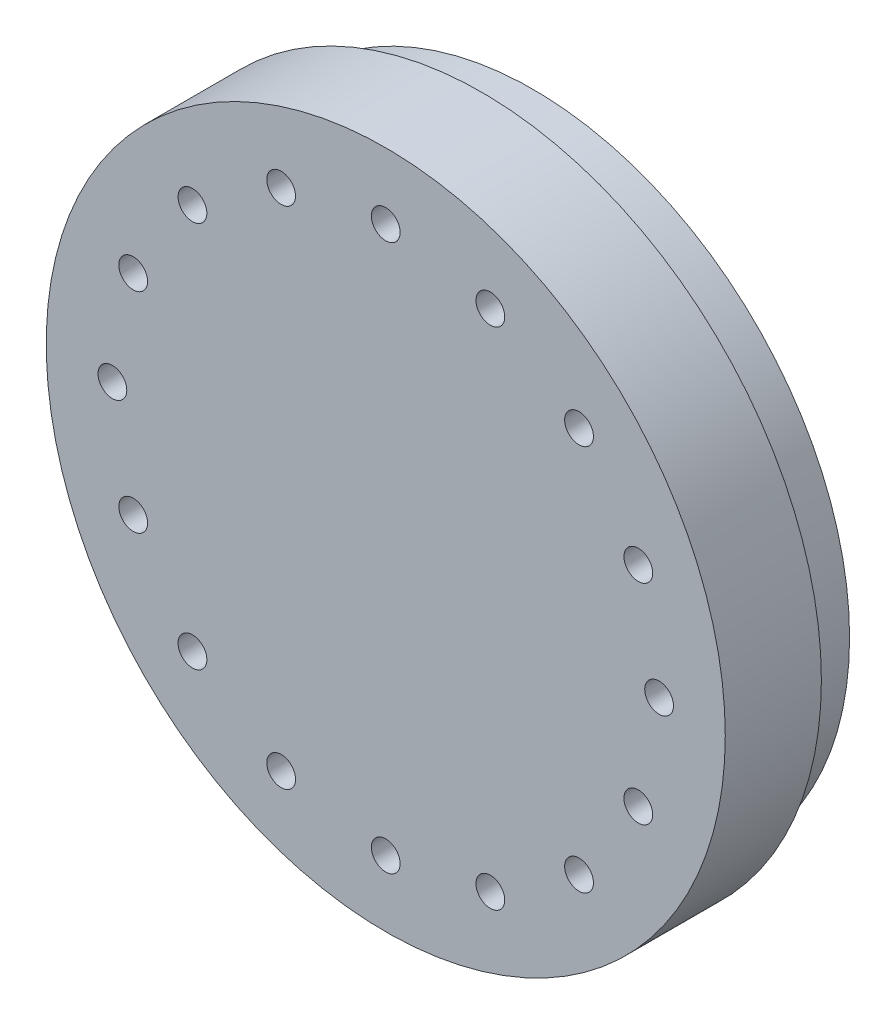
ISO-10303-21;
HEADER;
FILE_DESCRIPTION(('STEP AP214'),'2;1');
FILE_NAME('part.step','',(''),(''),'','','');
FILE_SCHEMA(('AUTOMOTIVE_DESIGN { 1 0 10303 214 1 1 1 1 }'));
ENDSEC;
DATA;
#1=APPLICATION_CONTEXT('core data for automotive mechanical design processes');
#2=APPLICATION_PROTOCOL_DEFINITION('international standard','automotive_design',2000,#1);
#3=PRODUCT_CONTEXT('',#1,'mechanical');
#4=PRODUCT('Part','Part','',(#3));
#5=PRODUCT_RELATED_PRODUCT_CATEGORY('part','',(#4));
#6=PRODUCT_DEFINITION_FORMATION('','',#4);
#7=PRODUCT_DEFINITION_CONTEXT('part definition',#1,'design');
#8=PRODUCT_DEFINITION('design','',#6,#7);
#9=PRODUCT_DEFINITION_SHAPE('','',#8);
#10=(LENGTH_UNIT() NAMED_UNIT(*) SI_UNIT(.MILLI.,.METRE.));
#11=(NAMED_UNIT(*) PLANE_ANGLE_UNIT() SI_UNIT($,.RADIAN.));
#12=(NAMED_UNIT(*) SI_UNIT($,.STERADIAN.) SOLID_ANGLE_UNIT());
#13=UNCERTAINTY_MEASURE_WITH_UNIT(LENGTH_MEASURE(1.E-05),#10,'distance_accuracy_value','');
#14=(GEOMETRIC_REPRESENTATION_CONTEXT(3) GLOBAL_UNCERTAINTY_ASSIGNED_CONTEXT((#13)) GLOBAL_UNIT_ASSIGNED_CONTEXT((#10,
#11,#12)) REPRESENTATION_CONTEXT('',''));
#15=CARTESIAN_POINT('',(0.,0.,0.));
#16=DIRECTION('',(0.,0.,1.));
#17=DIRECTION('',(1.,0.,0.));
#18=AXIS2_PLACEMENT_3D('',#15,#16,#17);
#19=CARTESIAN_POINT('',(0.,0.,4.175));
#20=DIRECTION('',(0.,0.,-1.));
#21=DIRECTION('',(-1.,0.,0.));
#22=AXIS2_PLACEMENT_3D('',#19,#20,#21);
#23=CYLINDRICAL_SURFACE('',#22,29.5);
#24=CARTESIAN_POINT('',(0.,0.,4.175));
#25=DIRECTION('',(0.,0.,1.));
#26=DIRECTION('',(1.,0.,0.));
#27=AXIS2_PLACEMENT_3D('',#24,#25,#26);
#28=CIRCLE('',#27,29.5);
#29=CARTESIAN_POINT('',(29.5,0.,4.175));
#30=VERTEX_POINT('',#29);
#31=EDGE_CURVE('E44',#30,#30,#28,.T.);
#32=ORIENTED_EDGE('',*,*,#31,.F.);
#33=EDGE_LOOP('',(#32));
#34=FACE_BOUND('',#33,.T.);
#35=CARTESIAN_POINT('',(0.,0.,-4.175));
#36=DIRECTION('',(0.,0.,1.));
#37=DIRECTION('',(1.,0.,0.));
#38=AXIS2_PLACEMENT_3D('',#35,#36,#37);
#39=CIRCLE('',#38,29.5);
#40=CARTESIAN_POINT('',(29.5,0.,-4.175));
#41=VERTEX_POINT('',#40);
#42=EDGE_CURVE('E40',#41,#41,#39,.T.);
#43=ORIENTED_EDGE('',*,*,#42,.T.);
#44=EDGE_LOOP('',(#43));
#45=FACE_BOUND('',#44,.T.);
#46=ADVANCED_FACE('F37',(#34,#45),#23,.T.);
#47=CARTESIAN_POINT('',(0.,0.,4.175));
#48=DIRECTION('',(0.,0.,1.));
#49=DIRECTION('',(1.,0.,0.));
#50=AXIS2_PLACEMENT_3D('',#47,#48,#49);
#51=PLANE('',#50);
#52=CARTESIAN_POINT('',(16.7937860531805,16.7937860531805,4.175));
#53=DIRECTION('',(0.,0.,1.));
#54=DIRECTION('',(0.707106781186546,-0.707106781186549,0.));
#55=AXIS2_PLACEMENT_3D('',#52,#53,#54);
#56=CIRCLE('',#55,1.25);
#57=CARTESIAN_POINT('',(17.6776695296637,15.9099025766973,4.175));
#58=VERTEX_POINT('',#57);
#59=EDGE_CURVE('E109',#58,#58,#56,.T.);
#60=ORIENTED_EDGE('',*,*,#59,.F.);
#61=EDGE_LOOP('',(#60));
#62=FACE_BOUND('',#61,.T.);
#63=CARTESIAN_POINT('',(21.9421388971431,9.08873151867083,4.175));
#64=DIRECTION('',(0.,0.,1.));
#65=DIRECTION('',(0.382683432365087,-0.923879532511288,0.));
#66=AXIS2_PLACEMENT_3D('',#63,#64,#65);
#67=CIRCLE('',#66,1.25);
#68=CARTESIAN_POINT('',(22.4204931875995,7.93388210303172,4.175));
#69=VERTEX_POINT('',#68);
#70=EDGE_CURVE('E103',#69,#69,#67,.T.);
#71=ORIENTED_EDGE('',*,*,#70,.F.);
#72=EDGE_LOOP('',(#71));
#73=FACE_BOUND('',#72,.T.);
#74=CARTESIAN_POINT('',(23.75,0.,4.175));
#75=DIRECTION('',(0.,0.,1.));
#76=DIRECTION('',(0.,-1.,0.));
#77=AXIS2_PLACEMENT_3D('',#74,#75,#76);
#78=CIRCLE('',#77,1.25);
#79=CARTESIAN_POINT('',(23.75,-1.25000000000008,4.175));
#80=VERTEX_POINT('',#79);
#81=EDGE_CURVE('E97',#80,#80,#78,.T.);
#82=ORIENTED_EDGE('',*,*,#81,.F.);
#83=EDGE_LOOP('',(#82));
#84=FACE_BOUND('',#83,.T.);
#85=CARTESIAN_POINT('',(21.942138897143,-9.08873151867098,4.175));
#86=DIRECTION('',(0.,0.,1.));
#87=DIRECTION('',(-0.382683432365094,-0.923879532511285,0.));
#88=AXIS2_PLACEMENT_3D('',#85,#86,#87);
#89=CIRCLE('',#88,1.25);
#90=CARTESIAN_POINT('',(21.4637846066867,-10.2435809343101,4.175));
#91=VERTEX_POINT('',#90);
#92=EDGE_CURVE('E91',#91,#91,#89,.T.);
#93=ORIENTED_EDGE('',*,*,#92,.F.);
#94=EDGE_LOOP('',(#93));
#95=FACE_BOUND('',#94,.T.);
#96=CARTESIAN_POINT('',(16.7937860531804,-16.7937860531806,4.175));
#97=DIRECTION('',(0.,0.,1.));
#98=DIRECTION('',(-0.707106781186551,-0.707106781186544,0.));
#99=AXIS2_PLACEMENT_3D('',#96,#97,#98);
#100=CIRCLE('',#99,1.25);
#101=CARTESIAN_POINT('',(15.9099025766972,-17.6776695296638,4.175));
#102=VERTEX_POINT('',#101);
#103=EDGE_CURVE('E85',#102,#102,#100,.T.);
#104=ORIENTED_EDGE('',*,*,#103,.F.);
#105=EDGE_LOOP('',(#104));
#106=FACE_BOUND('',#105,.T.);
#107=CARTESIAN_POINT('',(9.08873151867075,-21.9421388971431,4.175));
#108=DIRECTION('',(0.,0.,1.));
#109=DIRECTION('',(-0.923879532511289,-0.382683432365084,0.));
#110=AXIS2_PLACEMENT_3D('',#107,#108,#109);
#111=CIRCLE('',#110,1.25);
#112=CARTESIAN_POINT('',(7.93388210303164,-22.4204931875995,4.175));
#113=VERTEX_POINT('',#112);
#114=EDGE_CURVE('E79',#113,#113,#111,.T.);
#115=ORIENTED_EDGE('',*,*,#114,.F.);
#116=EDGE_LOOP('',(#115));
#117=FACE_BOUND('',#116,.T.);
#118=CARTESIAN_POINT('',(0.,-23.75,4.175));
#119=DIRECTION('',(0.,0.,1.));
#120=DIRECTION('',(-1.,0.,0.));
#121=AXIS2_PLACEMENT_3D('',#118,#119,#120);
#122=CIRCLE('',#121,1.25);
#123=CARTESIAN_POINT('',(-1.25,-23.75,4.175));
#124=VERTEX_POINT('',#123);
#125=EDGE_CURVE('E73',#124,#124,#122,.T.);
#126=ORIENTED_EDGE('',*,*,#125,.F.);
#127=EDGE_LOOP('',(#126));
#128=FACE_BOUND('',#127,.T.);
#129=CARTESIAN_POINT('',(-9.08873151867106,-21.942138897143,4.175));
#130=DIRECTION('',(0.,0.,1.));
#131=DIRECTION('',(-0.923879532511284,0.382683432365097,0.));
#132=AXIS2_PLACEMENT_3D('',#129,#130,#131);
#133=CIRCLE('',#132,1.25);
#134=CARTESIAN_POINT('',(-10.2435809343102,-21.4637846066866,4.175));
#135=VERTEX_POINT('',#134);
#136=EDGE_CURVE('E66',#135,#135,#133,.T.);
#137=ORIENTED_EDGE('',*,*,#136,.F.);
#138=EDGE_LOOP('',(#137));
#139=FACE_BOUND('',#138,.T.);
#140=CARTESIAN_POINT('',(-16.7937860531807,-16.7937860531804,4.175));
#141=DIRECTION('',(0.,0.,1.));
#142=DIRECTION('',(-0.707106781186541,0.707106781186554,0.));
#143=AXIS2_PLACEMENT_3D('',#140,#141,#142);
#144=CIRCLE('',#143,1.25);
#145=CARTESIAN_POINT('',(-17.6776695296638,-15.9099025766972,4.175));
#146=VERTEX_POINT('',#145);
#147=EDGE_CURVE('E144',#146,#146,#144,.T.);
#148=ORIENTED_EDGE('',*,*,#147,.F.);
#149=EDGE_LOOP('',(#148));
#150=FACE_BOUND('',#149,.T.);
#151=CARTESIAN_POINT('',(-21.9421388971432,-9.08873151867066,4.175));
#152=DIRECTION('',(0.,0.,1.));
#153=DIRECTION('',(-0.382683432365081,0.923879532511291,0.));
#154=AXIS2_PLACEMENT_3D('',#151,#152,#153);
#155=CIRCLE('',#154,1.25);
#156=CARTESIAN_POINT('',(-22.4204931875995,-7.93388210303155,4.175));
#157=VERTEX_POINT('',#156);
#158=EDGE_CURVE('E138',#157,#157,#155,.T.);
#159=ORIENTED_EDGE('',*,*,#158,.F.);
#160=EDGE_LOOP('',(#159));
#161=FACE_BOUND('',#160,.T.);
#162=CARTESIAN_POINT('',(-23.75,2.48768045392573E-13,4.175));
#163=DIRECTION('',(0.,0.,1.));
#164=DIRECTION('',(0.,1.,0.));
#165=AXIS2_PLACEMENT_3D('',#162,#163,#164);
#166=CIRCLE('',#165,1.25);
#167=CARTESIAN_POINT('',(-23.75,1.25000000000025,4.175));
#168=VERTEX_POINT('',#167);
#169=EDGE_CURVE('E132',#168,#168,#166,.T.);
#170=ORIENTED_EDGE('',*,*,#169,.F.);
#171=EDGE_LOOP('',(#170));
#172=FACE_BOUND('',#171,.T.);
#173=CARTESIAN_POINT('',(-21.942138897143,9.08873151867112,4.175));
#174=DIRECTION('',(0.,0.,1.));
#175=DIRECTION('',(0.3826834323651,0.923879532511283,0.));
#176=AXIS2_PLACEMENT_3D('',#173,#174,#175);
#177=CIRCLE('',#176,1.25);
#178=CARTESIAN_POINT('',(-21.4637846066866,10.2435809343102,4.175));
#179=VERTEX_POINT('',#178);
#180=EDGE_CURVE('E126',#179,#179,#177,.T.);
#181=ORIENTED_EDGE('',*,*,#180,.F.);
#182=EDGE_LOOP('',(#181));
#183=FACE_BOUND('',#182,.T.);
#184=CARTESIAN_POINT('',(-16.7937860531803,16.7937860531807,4.175));
#185=DIRECTION('',(0.,0.,1.));
#186=DIRECTION('',(0.707106781186556,0.707106781186539,0.));
#187=AXIS2_PLACEMENT_3D('',#184,#185,#186);
#188=CIRCLE('',#187,1.25);
#189=CARTESIAN_POINT('',(-15.9099025766971,17.6776695296639,4.175));
#190=VERTEX_POINT('',#189);
#191=EDGE_CURVE('E120',#190,#190,#188,.T.);
#192=ORIENTED_EDGE('',*,*,#191,.F.);
#193=EDGE_LOOP('',(#192));
#194=FACE_BOUND('',#193,.T.);
#195=CARTESIAN_POINT('',(-9.08873151867059,21.9421388971432,4.175));
#196=DIRECTION('',(0.,0.,1.));
#197=DIRECTION('',(0.923879532511292,0.382683432365077,0.));
#198=AXIS2_PLACEMENT_3D('',#195,#196,#197);
#199=CIRCLE('',#198,1.25);
#200=CARTESIAN_POINT('',(-7.93388210303147,22.4204931875995,4.175));
#201=VERTEX_POINT('',#200);
#202=EDGE_CURVE('E114',#201,#201,#199,.T.);
#203=ORIENTED_EDGE('',*,*,#202,.F.);
#204=EDGE_LOOP('',(#203));
#205=FACE_BOUND('',#204,.T.);
#206=CARTESIAN_POINT('',(9.0887315186709,21.9421388971431,4.175));
#207=DIRECTION('',(0.,0.,1.));
#208=DIRECTION('',(0.923879532511287,-0.382683432365091,0.));
#209=AXIS2_PLACEMENT_3D('',#206,#207,#208);
#210=CIRCLE('',#209,1.25);
#211=CARTESIAN_POINT('',(10.24358093431,21.4637846066867,4.175));
#212=VERTEX_POINT('',#211);
#213=EDGE_CURVE('E60',#212,#212,#210,.T.);
#214=ORIENTED_EDGE('',*,*,#213,.F.);
#215=EDGE_LOOP('',(#214));
#216=FACE_BOUND('',#215,.T.);
#217=CARTESIAN_POINT('',(0.,23.75,4.175));
#218=DIRECTION('',(0.,0.,1.));
#219=DIRECTION('',(1.,0.,0.));
#220=AXIS2_PLACEMENT_3D('',#217,#218,#219);
#221=CIRCLE('',#220,1.25);
#222=CARTESIAN_POINT('',(1.25,23.75,4.175));
#223=VERTEX_POINT('',#222);
#224=EDGE_CURVE('E54',#223,#223,#221,.T.);
#225=ORIENTED_EDGE('',*,*,#224,.F.);
#226=EDGE_LOOP('',(#225));
#227=FACE_BOUND('',#226,.T.);
#228=ORIENTED_EDGE('',*,*,#31,.T.);
#229=EDGE_LOOP('',(#228));
#230=FACE_BOUND('',#229,.T.);
#231=ADVANCED_FACE('F161',(#62,#73,#84,#95,#106,#117,#128,#139,#150,#161,#172,#183,#194,#205,
#216,#227,#230),#51,.T.);
#232=CARTESIAN_POINT('',(0.,0.,-4.175));
#233=DIRECTION('',(0.,0.,1.));
#234=DIRECTION('',(1.,0.,0.));
#235=AXIS2_PLACEMENT_3D('',#232,#233,#234);
#236=PLANE('',#235);
#237=CARTESIAN_POINT('',(0.,0.,-4.175));
#238=DIRECTION('',(0.,0.,-1.));
#239=DIRECTION('',(-1.,0.,0.));
#240=AXIS2_PLACEMENT_3D('',#237,#238,#239);
#241=CIRCLE('',#240,27.5);
#242=CARTESIAN_POINT('',(-27.5,0.,-4.175));
#243=VERTEX_POINT('',#242);
#244=EDGE_CURVE('E10',#243,#243,#241,.T.);
#245=ORIENTED_EDGE('',*,*,#244,.F.);
#246=EDGE_LOOP('',(#245));
#247=FACE_BOUND('',#246,.T.);
#248=ORIENTED_EDGE('',*,*,#42,.F.);
#249=EDGE_LOOP('',(#248));
#250=FACE_BOUND('',#249,.T.);
#251=ADVANCED_FACE('F164',(#247,#250),#236,.F.);
#252=CARTESIAN_POINT('',(0.,0.,-8.625));
#253=DIRECTION('',(0.,0.,1.));
#254=DIRECTION('',(1.,0.,0.));
#255=AXIS2_PLACEMENT_3D('',#252,#253,#254);
#256=CYLINDRICAL_SURFACE('',#255,27.5);
#257=CARTESIAN_POINT('',(0.,0.,-8.625));
#258=DIRECTION('',(0.,0.,-1.));
#259=DIRECTION('',(-1.,0.,0.));
#260=AXIS2_PLACEMENT_3D('',#257,#258,#259);
#261=CIRCLE('',#260,27.5);
#262=CARTESIAN_POINT('',(-27.5,0.,-8.625));
#263=VERTEX_POINT('',#262);
#264=EDGE_CURVE('E50',#263,#263,#261,.T.);
#265=ORIENTED_EDGE('',*,*,#264,.F.);
#266=EDGE_LOOP('',(#265));
#267=FACE_BOUND('',#266,.T.);
#268=ORIENTED_EDGE('',*,*,#244,.T.);
#269=EDGE_LOOP('',(#268));
#270=FACE_BOUND('',#269,.T.);
#271=ADVANCED_FACE('F189',(#267,#270),#256,.T.);
#272=CARTESIAN_POINT('',(0.,0.,-8.625));
#273=DIRECTION('',(0.,0.,-1.));
#274=DIRECTION('',(-1.,0.,0.));
#275=AXIS2_PLACEMENT_3D('',#272,#273,#274);
#276=PLANE('',#275);
#277=CARTESIAN_POINT('',(16.7937860531805,16.7937860531805,-8.625));
#278=DIRECTION('',(0.,0.,1.));
#279=DIRECTION('',(0.707106781186546,-0.707106781186549,0.));
#280=AXIS2_PLACEMENT_3D('',#277,#278,#279);
#281=CIRCLE('',#280,1.25);
#282=CARTESIAN_POINT('',(17.6776695296637,15.9099025766973,-8.625));
#283=VERTEX_POINT('',#282);
#284=EDGE_CURVE('E63',#283,#283,#281,.T.);
#285=ORIENTED_EDGE('',*,*,#284,.T.);
#286=EDGE_LOOP('',(#285));
#287=FACE_BOUND('',#286,.T.);
#288=CARTESIAN_POINT('',(21.9421388971431,9.08873151867083,-8.625));
#289=DIRECTION('',(0.,0.,1.));
#290=DIRECTION('',(0.382683432365087,-0.923879532511288,0.));
#291=AXIS2_PLACEMENT_3D('',#288,#289,#290);
#292=CIRCLE('',#291,1.25);
#293=CARTESIAN_POINT('',(22.4204931875995,7.93388210303172,-8.625));
#294=VERTEX_POINT('',#293);
#295=EDGE_CURVE('E106',#294,#294,#292,.T.);
#296=ORIENTED_EDGE('',*,*,#295,.T.);
#297=EDGE_LOOP('',(#296));
#298=FACE_BOUND('',#297,.T.);
#299=CARTESIAN_POINT('',(23.75,0.,-8.625));
#300=DIRECTION('',(0.,0.,1.));
#301=DIRECTION('',(0.,-1.,0.));
#302=AXIS2_PLACEMENT_3D('',#299,#300,#301);
#303=CIRCLE('',#302,1.25);
#304=CARTESIAN_POINT('',(23.75,-1.25000000000008,-8.625));
#305=VERTEX_POINT('',#304);
#306=EDGE_CURVE('E100',#305,#305,#303,.T.);
#307=ORIENTED_EDGE('',*,*,#306,.T.);
#308=EDGE_LOOP('',(#307));
#309=FACE_BOUND('',#308,.T.);
#310=CARTESIAN_POINT('',(21.942138897143,-9.08873151867098,-8.625));
#311=DIRECTION('',(0.,0.,1.));
#312=DIRECTION('',(-0.382683432365094,-0.923879532511285,0.));
#313=AXIS2_PLACEMENT_3D('',#310,#311,#312);
#314=CIRCLE('',#313,1.25);
#315=CARTESIAN_POINT('',(21.4637846066867,-10.2435809343101,-8.625));
#316=VERTEX_POINT('',#315);
#317=EDGE_CURVE('E94',#316,#316,#314,.T.);
#318=ORIENTED_EDGE('',*,*,#317,.T.);
#319=EDGE_LOOP('',(#318));
#320=FACE_BOUND('',#319,.T.);
#321=CARTESIAN_POINT('',(16.7937860531804,-16.7937860531806,-8.625));
#322=DIRECTION('',(0.,0.,1.));
#323=DIRECTION('',(-0.707106781186551,-0.707106781186544,0.));
#324=AXIS2_PLACEMENT_3D('',#321,#322,#323);
#325=CIRCLE('',#324,1.25);
#326=CARTESIAN_POINT('',(15.9099025766972,-17.6776695296638,-8.625));
#327=VERTEX_POINT('',#326);
#328=EDGE_CURVE('E88',#327,#327,#325,.T.);
#329=ORIENTED_EDGE('',*,*,#328,.T.);
#330=EDGE_LOOP('',(#329));
#331=FACE_BOUND('',#330,.T.);
#332=CARTESIAN_POINT('',(9.08873151867075,-21.9421388971431,-8.625));
#333=DIRECTION('',(0.,0.,1.));
#334=DIRECTION('',(-0.923879532511289,-0.382683432365084,0.));
#335=AXIS2_PLACEMENT_3D('',#332,#333,#334);
#336=CIRCLE('',#335,1.25);
#337=CARTESIAN_POINT('',(7.93388210303164,-22.4204931875995,-8.625));
#338=VERTEX_POINT('',#337);
#339=EDGE_CURVE('E82',#338,#338,#336,.T.);
#340=ORIENTED_EDGE('',*,*,#339,.T.);
#341=EDGE_LOOP('',(#340));
#342=FACE_BOUND('',#341,.T.);
#343=CARTESIAN_POINT('',(0.,-23.75,-8.625));
#344=DIRECTION('',(0.,0.,1.));
#345=DIRECTION('',(-1.,0.,0.));
#346=AXIS2_PLACEMENT_3D('',#343,#344,#345);
#347=CIRCLE('',#346,1.25);
#348=CARTESIAN_POINT('',(-1.25,-23.75,-8.625));
#349=VERTEX_POINT('',#348);
#350=EDGE_CURVE('E76',#349,#349,#347,.T.);
#351=ORIENTED_EDGE('',*,*,#350,.T.);
#352=EDGE_LOOP('',(#351));
#353=FACE_BOUND('',#352,.T.);
#354=CARTESIAN_POINT('',(-9.08873151867106,-21.942138897143,-8.625));
#355=DIRECTION('',(0.,0.,1.));
#356=DIRECTION('',(-0.923879532511284,0.382683432365097,0.));
#357=AXIS2_PLACEMENT_3D('',#354,#355,#356);
#358=CIRCLE('',#357,1.25);
#359=CARTESIAN_POINT('',(-10.2435809343102,-21.4637846066866,-8.625));
#360=VERTEX_POINT('',#359);
#361=EDGE_CURVE('E69',#360,#360,#358,.T.);
#362=ORIENTED_EDGE('',*,*,#361,.T.);
#363=EDGE_LOOP('',(#362));
#364=FACE_BOUND('',#363,.T.);
#365=CARTESIAN_POINT('',(-16.7937860531807,-16.7937860531804,-8.625));
#366=DIRECTION('',(0.,0.,1.));
#367=DIRECTION('',(-0.707106781186541,0.707106781186554,0.));
#368=AXIS2_PLACEMENT_3D('',#365,#366,#367);
#369=CIRCLE('',#368,1.25);
#370=CARTESIAN_POINT('',(-17.6776695296638,-15.9099025766972,-8.625));
#371=VERTEX_POINT('',#370);
#372=EDGE_CURVE('E70',#371,#371,#369,.T.);
#373=ORIENTED_EDGE('',*,*,#372,.T.);
#374=EDGE_LOOP('',(#373));
#375=FACE_BOUND('',#374,.T.);
#376=CARTESIAN_POINT('',(-21.9421388971432,-9.08873151867066,-8.625));
#377=DIRECTION('',(0.,0.,1.));
#378=DIRECTION('',(-0.382683432365081,0.923879532511291,0.));
#379=AXIS2_PLACEMENT_3D('',#376,#377,#378);
#380=CIRCLE('',#379,1.25);
#381=CARTESIAN_POINT('',(-22.4204931875995,-7.93388210303155,-8.625));
#382=VERTEX_POINT('',#381);
#383=EDGE_CURVE('E141',#382,#382,#380,.T.);
#384=ORIENTED_EDGE('',*,*,#383,.T.);
#385=EDGE_LOOP('',(#384));
#386=FACE_BOUND('',#385,.T.);
#387=CARTESIAN_POINT('',(-23.75,2.48768045392573E-13,-8.625));
#388=DIRECTION('',(0.,0.,1.));
#389=DIRECTION('',(0.,1.,0.));
#390=AXIS2_PLACEMENT_3D('',#387,#388,#389);
#391=CIRCLE('',#390,1.25);
#392=CARTESIAN_POINT('',(-23.75,1.25000000000025,-8.625));
#393=VERTEX_POINT('',#392);
#394=EDGE_CURVE('E135',#393,#393,#391,.T.);
#395=ORIENTED_EDGE('',*,*,#394,.T.);
#396=EDGE_LOOP('',(#395));
#397=FACE_BOUND('',#396,.T.);
#398=CARTESIAN_POINT('',(-21.942138897143,9.08873151867112,-8.625));
#399=DIRECTION('',(0.,0.,1.));
#400=DIRECTION('',(0.3826834323651,0.923879532511283,0.));
#401=AXIS2_PLACEMENT_3D('',#398,#399,#400);
#402=CIRCLE('',#401,1.25);
#403=CARTESIAN_POINT('',(-21.4637846066866,10.2435809343102,-8.625));
#404=VERTEX_POINT('',#403);
#405=EDGE_CURVE('E129',#404,#404,#402,.T.);
#406=ORIENTED_EDGE('',*,*,#405,.T.);
#407=EDGE_LOOP('',(#406));
#408=FACE_BOUND('',#407,.T.);
#409=CARTESIAN_POINT('',(-16.7937860531803,16.7937860531807,-8.625));
#410=DIRECTION('',(0.,0.,1.));
#411=DIRECTION('',(0.707106781186556,0.707106781186539,0.));
#412=AXIS2_PLACEMENT_3D('',#409,#410,#411);
#413=CIRCLE('',#412,1.25);
#414=CARTESIAN_POINT('',(-15.9099025766971,17.6776695296639,-8.625));
#415=VERTEX_POINT('',#414);
#416=EDGE_CURVE('E123',#415,#415,#413,.T.);
#417=ORIENTED_EDGE('',*,*,#416,.T.);
#418=EDGE_LOOP('',(#417));
#419=FACE_BOUND('',#418,.T.);
#420=CARTESIAN_POINT('',(-9.08873151867059,21.9421388971432,-8.625));
#421=DIRECTION('',(0.,0.,1.));
#422=DIRECTION('',(0.923879532511292,0.382683432365077,0.));
#423=AXIS2_PLACEMENT_3D('',#420,#421,#422);
#424=CIRCLE('',#423,1.25);
#425=CARTESIAN_POINT('',(-7.93388210303147,22.4204931875995,-8.625));
#426=VERTEX_POINT('',#425);
#427=EDGE_CURVE('E117',#426,#426,#424,.T.);
#428=ORIENTED_EDGE('',*,*,#427,.T.);
#429=EDGE_LOOP('',(#428));
#430=FACE_BOUND('',#429,.T.);
#431=CARTESIAN_POINT('',(9.0887315186709,21.9421388971431,-8.625));
#432=DIRECTION('',(0.,0.,1.));
#433=DIRECTION('',(0.923879532511287,-0.382683432365091,0.));
#434=AXIS2_PLACEMENT_3D('',#431,#432,#433);
#435=CIRCLE('',#434,1.25);
#436=CARTESIAN_POINT('',(10.24358093431,21.4637846066867,-8.625));
#437=VERTEX_POINT('',#436);
#438=EDGE_CURVE('E57',#437,#437,#435,.T.);
#439=ORIENTED_EDGE('',*,*,#438,.T.);
#440=EDGE_LOOP('',(#439));
#441=FACE_BOUND('',#440,.T.);
#442=CARTESIAN_POINT('',(0.,23.75,-8.625));
#443=DIRECTION('',(0.,0.,1.));
#444=DIRECTION('',(1.,0.,0.));
#445=AXIS2_PLACEMENT_3D('',#442,#443,#444);
#446=CIRCLE('',#445,1.25);
#447=CARTESIAN_POINT('',(1.25,23.75,-8.625));
#448=VERTEX_POINT('',#447);
#449=EDGE_CURVE('E53',#448,#448,#446,.T.);
#450=ORIENTED_EDGE('',*,*,#449,.T.);
#451=EDGE_LOOP('',(#450));
#452=FACE_BOUND('',#451,.T.);
#453=ORIENTED_EDGE('',*,*,#264,.T.);
#454=EDGE_LOOP('',(#453));
#455=FACE_BOUND('',#454,.T.);
#456=ADVANCED_FACE('F150',(#287,#298,#309,#320,#331,#342,#353,#364,#375,#386,#397,#408,#419,
#430,#441,#452,#455),#276,.T.);
#457=CARTESIAN_POINT('',(0.,23.75,-8.625));
#458=DIRECTION('',(0.,0.,1.));
#459=DIRECTION('',(1.,0.,0.));
#460=AXIS2_PLACEMENT_3D('',#457,#458,#459);
#461=CYLINDRICAL_SURFACE('',#460,1.25);
#462=ORIENTED_EDGE('',*,*,#449,.F.);
#463=EDGE_LOOP('',(#462));
#464=FACE_BOUND('',#463,.T.);
#465=ORIENTED_EDGE('',*,*,#224,.T.);
#466=EDGE_LOOP('',(#465));
#467=FACE_BOUND('',#466,.T.);
#468=ADVANCED_FACE('F199',(#464,#467),#461,.F.);
#469=CARTESIAN_POINT('',(9.0887315186709,21.9421388971431,-8.625));
#470=DIRECTION('',(0.,0.,1.));
#471=DIRECTION('',(1.,0.,0.));
#472=AXIS2_PLACEMENT_3D('',#469,#470,#471);
#473=CYLINDRICAL_SURFACE('',#472,1.25);
#474=ORIENTED_EDGE('',*,*,#438,.F.);
#475=EDGE_LOOP('',(#474));
#476=FACE_BOUND('',#475,.T.);
#477=ORIENTED_EDGE('',*,*,#213,.T.);
#478=EDGE_LOOP('',(#477));
#479=FACE_BOUND('',#478,.T.);
#480=ADVANCED_FACE('F203',(#476,#479),#473,.F.);
#481=CARTESIAN_POINT('',(-9.08873151867059,21.9421388971432,-8.625));
#482=DIRECTION('',(0.,0.,1.));
#483=DIRECTION('',(1.,0.,0.));
#484=AXIS2_PLACEMENT_3D('',#481,#482,#483);
#485=CYLINDRICAL_SURFACE('',#484,1.25);
#486=ORIENTED_EDGE('',*,*,#427,.F.);
#487=EDGE_LOOP('',(#486));
#488=FACE_BOUND('',#487,.T.);
#489=ORIENTED_EDGE('',*,*,#202,.T.);
#490=EDGE_LOOP('',(#489));
#491=FACE_BOUND('',#490,.T.);
#492=ADVANCED_FACE('F207',(#488,#491),#485,.F.);
#493=CARTESIAN_POINT('',(-16.7937860531803,16.7937860531807,-8.625));
#494=DIRECTION('',(0.,0.,1.));
#495=DIRECTION('',(1.,0.,0.));
#496=AXIS2_PLACEMENT_3D('',#493,#494,#495);
#497=CYLINDRICAL_SURFACE('',#496,1.25);
#498=ORIENTED_EDGE('',*,*,#416,.F.);
#499=EDGE_LOOP('',(#498));
#500=FACE_BOUND('',#499,.T.);
#501=ORIENTED_EDGE('',*,*,#191,.T.);
#502=EDGE_LOOP('',(#501));
#503=FACE_BOUND('',#502,.T.);
#504=ADVANCED_FACE('F242',(#500,#503),#497,.F.);
#505=CARTESIAN_POINT('',(-21.942138897143,9.08873151867112,-8.625));
#506=DIRECTION('',(0.,0.,1.));
#507=DIRECTION('',(1.,0.,0.));
#508=AXIS2_PLACEMENT_3D('',#505,#506,#507);
#509=CYLINDRICAL_SURFACE('',#508,1.25);
#510=ORIENTED_EDGE('',*,*,#405,.F.);
#511=EDGE_LOOP('',(#510));
#512=FACE_BOUND('',#511,.T.);
#513=ORIENTED_EDGE('',*,*,#180,.T.);
#514=EDGE_LOOP('',(#513));
#515=FACE_BOUND('',#514,.T.);
#516=ADVANCED_FACE('F246',(#512,#515),#509,.F.);
#517=CARTESIAN_POINT('',(-23.75,2.48768045392573E-13,-8.625));
#518=DIRECTION('',(0.,0.,1.));
#519=DIRECTION('',(1.,0.,0.));
#520=AXIS2_PLACEMENT_3D('',#517,#518,#519);
#521=CYLINDRICAL_SURFACE('',#520,1.25);
#522=ORIENTED_EDGE('',*,*,#394,.F.);
#523=EDGE_LOOP('',(#522));
#524=FACE_BOUND('',#523,.T.);
#525=ORIENTED_EDGE('',*,*,#169,.T.);
#526=EDGE_LOOP('',(#525));
#527=FACE_BOUND('',#526,.T.);
#528=ADVANCED_FACE('F250',(#524,#527),#521,.F.);
#529=CARTESIAN_POINT('',(-21.9421388971432,-9.08873151867066,-8.625));
#530=DIRECTION('',(0.,0.,1.));
#531=DIRECTION('',(1.,0.,0.));
#532=AXIS2_PLACEMENT_3D('',#529,#530,#531);
#533=CYLINDRICAL_SURFACE('',#532,1.25);
#534=ORIENTED_EDGE('',*,*,#383,.F.);
#535=EDGE_LOOP('',(#534));
#536=FACE_BOUND('',#535,.T.);
#537=ORIENTED_EDGE('',*,*,#158,.T.);
#538=EDGE_LOOP('',(#537));
#539=FACE_BOUND('',#538,.T.);
#540=ADVANCED_FACE('F157',(#536,#539),#533,.F.);
#541=CARTESIAN_POINT('',(-16.7937860531807,-16.7937860531804,-8.625));
#542=DIRECTION('',(0.,0.,1.));
#543=DIRECTION('',(1.,0.,0.));
#544=AXIS2_PLACEMENT_3D('',#541,#542,#543);
#545=CYLINDRICAL_SURFACE('',#544,1.25);
#546=ORIENTED_EDGE('',*,*,#372,.F.);
#547=EDGE_LOOP('',(#546));
#548=FACE_BOUND('',#547,.T.);
#549=ORIENTED_EDGE('',*,*,#147,.T.);
#550=EDGE_LOOP('',(#549));
#551=FACE_BOUND('',#550,.T.);
#552=ADVANCED_FACE('F153',(#548,#551),#545,.F.);
#553=CARTESIAN_POINT('',(-9.08873151867106,-21.942138897143,-8.625));
#554=DIRECTION('',(0.,0.,1.));
#555=DIRECTION('',(1.,0.,0.));
#556=AXIS2_PLACEMENT_3D('',#553,#554,#555);
#557=CYLINDRICAL_SURFACE('',#556,1.25);
#558=ORIENTED_EDGE('',*,*,#361,.F.);
#559=EDGE_LOOP('',(#558));
#560=FACE_BOUND('',#559,.T.);
#561=ORIENTED_EDGE('',*,*,#136,.T.);
#562=EDGE_LOOP('',(#561));
#563=FACE_BOUND('',#562,.T.);
#564=ADVANCED_FACE('F156',(#560,#563),#557,.F.);
#565=CARTESIAN_POINT('',(0.,-23.75,-8.625));
#566=DIRECTION('',(0.,0.,1.));
#567=DIRECTION('',(1.,0.,0.));
#568=AXIS2_PLACEMENT_3D('',#565,#566,#567);
#569=CYLINDRICAL_SURFACE('',#568,1.25);
#570=ORIENTED_EDGE('',*,*,#350,.F.);
#571=EDGE_LOOP('',(#570));
#572=FACE_BOUND('',#571,.T.);
#573=ORIENTED_EDGE('',*,*,#125,.T.);
#574=EDGE_LOOP('',(#573));
#575=FACE_BOUND('',#574,.T.);
#576=ADVANCED_FACE('F211',(#572,#575),#569,.F.);
#577=CARTESIAN_POINT('',(9.08873151867075,-21.9421388971431,-8.625));
#578=DIRECTION('',(0.,0.,1.));
#579=DIRECTION('',(1.,0.,0.));
#580=AXIS2_PLACEMENT_3D('',#577,#578,#579);
#581=CYLINDRICAL_SURFACE('',#580,1.25);
#582=ORIENTED_EDGE('',*,*,#339,.F.);
#583=EDGE_LOOP('',(#582));
#584=FACE_BOUND('',#583,.T.);
#585=ORIENTED_EDGE('',*,*,#114,.T.);
#586=EDGE_LOOP('',(#585));
#587=FACE_BOUND('',#586,.T.);
#588=ADVANCED_FACE('F215',(#584,#587),#581,.F.);
#589=CARTESIAN_POINT('',(16.7937860531804,-16.7937860531806,-8.625));
#590=DIRECTION('',(0.,0.,1.));
#591=DIRECTION('',(1.,0.,0.));
#592=AXIS2_PLACEMENT_3D('',#589,#590,#591);
#593=CYLINDRICAL_SURFACE('',#592,1.25);
#594=ORIENTED_EDGE('',*,*,#328,.F.);
#595=EDGE_LOOP('',(#594));
#596=FACE_BOUND('',#595,.T.);
#597=ORIENTED_EDGE('',*,*,#103,.T.);
#598=EDGE_LOOP('',(#597));
#599=FACE_BOUND('',#598,.T.);
#600=ADVANCED_FACE('F219',(#596,#599),#593,.F.);
#601=CARTESIAN_POINT('',(21.942138897143,-9.08873151867098,-8.625));
#602=DIRECTION('',(0.,0.,1.));
#603=DIRECTION('',(1.,0.,0.));
#604=AXIS2_PLACEMENT_3D('',#601,#602,#603);
#605=CYLINDRICAL_SURFACE('',#604,1.25);
#606=ORIENTED_EDGE('',*,*,#317,.F.);
#607=EDGE_LOOP('',(#606));
#608=FACE_BOUND('',#607,.T.);
#609=ORIENTED_EDGE('',*,*,#92,.T.);
#610=EDGE_LOOP('',(#609));
#611=FACE_BOUND('',#610,.T.);
#612=ADVANCED_FACE('F223',(#608,#611),#605,.F.);
#613=CARTESIAN_POINT('',(23.75,0.,-8.625));
#614=DIRECTION('',(0.,0.,1.));
#615=DIRECTION('',(1.,0.,0.));
#616=AXIS2_PLACEMENT_3D('',#613,#614,#615);
#617=CYLINDRICAL_SURFACE('',#616,1.25);
#618=ORIENTED_EDGE('',*,*,#306,.F.);
#619=EDGE_LOOP('',(#618));
#620=FACE_BOUND('',#619,.T.);
#621=ORIENTED_EDGE('',*,*,#81,.T.);
#622=EDGE_LOOP('',(#621));
#623=FACE_BOUND('',#622,.T.);
#624=ADVANCED_FACE('F227',(#620,#623),#617,.F.);
#625=CARTESIAN_POINT('',(21.9421388971431,9.08873151867083,-8.625));
#626=DIRECTION('',(0.,0.,1.));
#627=DIRECTION('',(1.,0.,0.));
#628=AXIS2_PLACEMENT_3D('',#625,#626,#627);
#629=CYLINDRICAL_SURFACE('',#628,1.25);
#630=ORIENTED_EDGE('',*,*,#295,.F.);
#631=EDGE_LOOP('',(#630));
#632=FACE_BOUND('',#631,.T.);
#633=ORIENTED_EDGE('',*,*,#70,.T.);
#634=EDGE_LOOP('',(#633));
#635=FACE_BOUND('',#634,.T.);
#636=ADVANCED_FACE('F231',(#632,#635),#629,.F.);
#637=CARTESIAN_POINT('',(16.7937860531805,16.7937860531805,-8.625));
#638=DIRECTION('',(0.,0.,1.));
#639=DIRECTION('',(1.,0.,0.));
#640=AXIS2_PLACEMENT_3D('',#637,#638,#639);
#641=CYLINDRICAL_SURFACE('',#640,1.25);
#642=ORIENTED_EDGE('',*,*,#284,.F.);
#643=EDGE_LOOP('',(#642));
#644=FACE_BOUND('',#643,.T.);
#645=ORIENTED_EDGE('',*,*,#59,.T.);
#646=EDGE_LOOP('',(#645));
#647=FACE_BOUND('',#646,.T.);
#648=ADVANCED_FACE('F235',(#644,#647),#641,.F.);
#649=CLOSED_SHELL('',(#46,#231,#251,#271,#456,#468,#480,#492,#504,#516,#528,#540,#552,#564,#576,
#588,#600,#612,#624,#636,#648));
#650=MANIFOLD_SOLID_BREP('B2',#649);
#651=ADVANCED_BREP_SHAPE_REPRESENTATION('',(#18,#650),#14);
#652=SHAPE_DEFINITION_REPRESENTATION(#9,#651);
ENDSEC;
END-ISO-10303-21;
